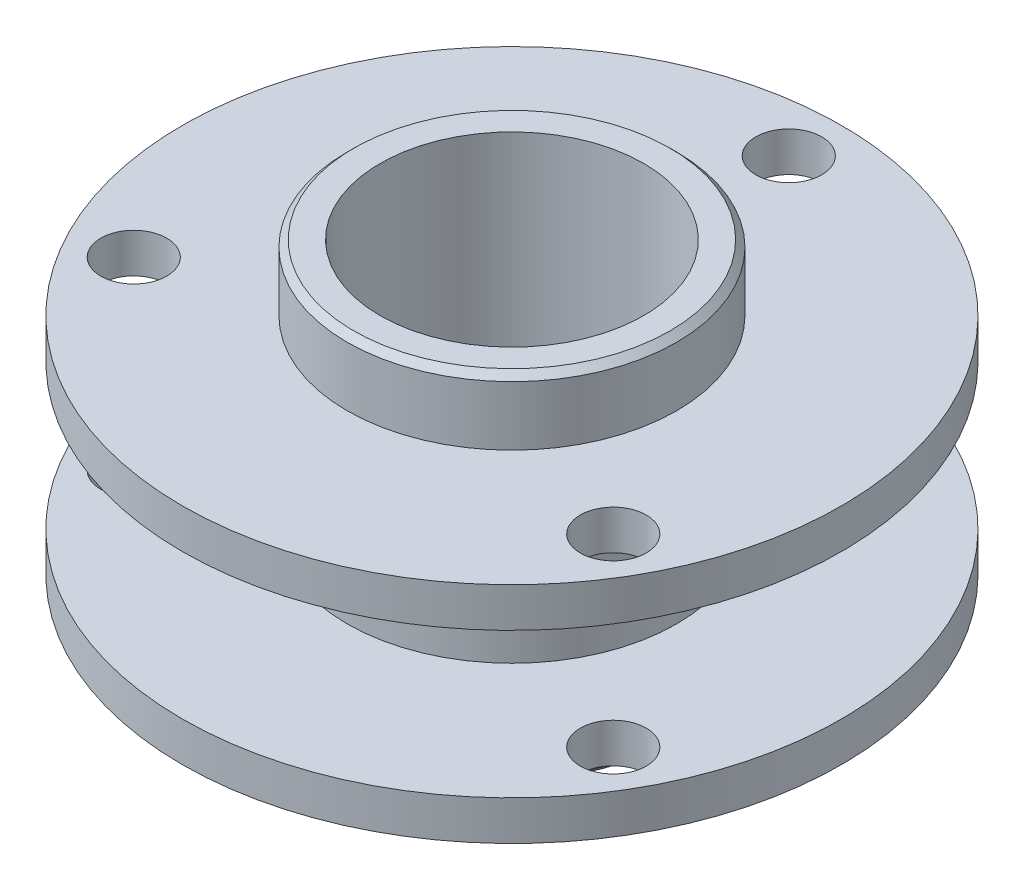
ISO-10303-21;
HEADER;
FILE_DESCRIPTION(('STEP AP214'),'2;1');
FILE_NAME('part.step','',(''),(''),'','','');
FILE_SCHEMA(('AUTOMOTIVE_DESIGN { 1 0 10303 214 1 1 1 1 }'));
ENDSEC;
DATA;
#1=APPLICATION_CONTEXT('core data for automotive mechanical design processes');
#2=APPLICATION_PROTOCOL_DEFINITION('international standard','automotive_design',2000,#1);
#3=PRODUCT_CONTEXT('',#1,'mechanical');
#4=PRODUCT('Part','Part','',(#3));
#5=PRODUCT_RELATED_PRODUCT_CATEGORY('part','',(#4));
#6=PRODUCT_DEFINITION_FORMATION('','',#4);
#7=PRODUCT_DEFINITION_CONTEXT('part definition',#1,'design');
#8=PRODUCT_DEFINITION('design','',#6,#7);
#9=PRODUCT_DEFINITION_SHAPE('','',#8);
#10=(LENGTH_UNIT() NAMED_UNIT(*) SI_UNIT(.MILLI.,.METRE.));
#11=(NAMED_UNIT(*) PLANE_ANGLE_UNIT() SI_UNIT($,.RADIAN.));
#12=(NAMED_UNIT(*) SI_UNIT($,.STERADIAN.) SOLID_ANGLE_UNIT());
#13=UNCERTAINTY_MEASURE_WITH_UNIT(LENGTH_MEASURE(1.E-05),#10,'distance_accuracy_value','');
#14=(GEOMETRIC_REPRESENTATION_CONTEXT(3) GLOBAL_UNCERTAINTY_ASSIGNED_CONTEXT((#13)) GLOBAL_UNIT_ASSIGNED_CONTEXT((#10,
#11,#12)) REPRESENTATION_CONTEXT('',''));
#15=CARTESIAN_POINT('',(0.,0.,0.));
#16=DIRECTION('',(0.,0.,1.));
#17=DIRECTION('',(1.,0.,0.));
#18=AXIS2_PLACEMENT_3D('',#15,#16,#17);
#19=CARTESIAN_POINT('',(0.,-13.5,0.));
#20=DIRECTION('',(0.,-1.,0.));
#21=DIRECTION('',(0.,0.,-1.));
#22=AXIS2_PLACEMENT_3D('',#19,#20,#21);
#23=PLANE('',#22);
#24=CARTESIAN_POINT('',(0.,-13.5,0.));
#25=DIRECTION('',(0.,1.,0.));
#26=DIRECTION('',(0.,0.,1.));
#27=AXIS2_PLACEMENT_3D('',#24,#25,#26);
#28=CIRCLE('',#27,10.);
#29=CARTESIAN_POINT('',(0.,-13.5,10.));
#30=VERTEX_POINT('',#29);
#31=EDGE_CURVE('E18',#30,#30,#28,.T.);
#32=ORIENTED_EDGE('',*,*,#31,.T.);
#33=EDGE_LOOP('',(#32));
#34=FACE_BOUND('',#33,.T.);
#35=CARTESIAN_POINT('',(0.,-13.5,0.));
#36=DIRECTION('',(0.,1.,0.));
#37=DIRECTION('',(0.,0.,1.));
#38=AXIS2_PLACEMENT_3D('',#35,#36,#37);
#39=CIRCLE('',#38,12.);
#40=CARTESIAN_POINT('',(0.,-13.5,12.));
#41=VERTEX_POINT('',#40);
#42=EDGE_CURVE('E92',#41,#41,#39,.T.);
#43=ORIENTED_EDGE('',*,*,#42,.F.);
#44=EDGE_LOOP('',(#43));
#45=FACE_BOUND('',#44,.T.);
#46=ADVANCED_FACE('F15',(#34,#45),#23,.T.);
#47=CARTESIAN_POINT('',(0.,-13.5,0.));
#48=DIRECTION('',(0.,1.,0.));
#49=DIRECTION('',(0.,0.,1.));
#50=AXIS2_PLACEMENT_3D('',#47,#48,#49);
#51=CYLINDRICAL_SURFACE('',#50,10.);
#52=ORIENTED_EDGE('',*,*,#31,.F.);
#53=EDGE_LOOP('',(#52));
#54=FACE_BOUND('',#53,.T.);
#55=CARTESIAN_POINT('',(0.,13.5,0.));
#56=DIRECTION('',(0.,1.,0.));
#57=DIRECTION('',(0.,0.,1.));
#58=AXIS2_PLACEMENT_3D('',#55,#56,#57);
#59=CIRCLE('',#58,10.);
#60=CARTESIAN_POINT('',(0.,13.5,10.));
#61=VERTEX_POINT('',#60);
#62=EDGE_CURVE('E90',#61,#61,#59,.T.);
#63=ORIENTED_EDGE('',*,*,#62,.T.);
#64=EDGE_LOOP('',(#63));
#65=FACE_BOUND('',#64,.T.);
#66=ADVANCED_FACE('F101',(#54,#65),#51,.F.);
#67=CARTESIAN_POINT('',(0.,-13.,0.));
#68=DIRECTION('',(0.,1.,0.));
#69=DIRECTION('',(0.,0.,1.));
#70=AXIS2_PLACEMENT_3D('',#67,#68,#69);
#71=CONICAL_SURFACE('',#70,12.5,0.785398163397442);
#72=ORIENTED_EDGE('',*,*,#42,.T.);
#73=EDGE_LOOP('',(#72));
#74=FACE_BOUND('',#73,.T.);
#75=CARTESIAN_POINT('',(0.,-13.,0.));
#76=DIRECTION('',(0.,1.,0.));
#77=DIRECTION('',(0.,0.,1.));
#78=AXIS2_PLACEMENT_3D('',#75,#76,#77);
#79=CIRCLE('',#78,12.5);
#80=CARTESIAN_POINT('',(0.,-13.,12.5));
#81=VERTEX_POINT('',#80);
#82=EDGE_CURVE('E30',#81,#81,#79,.T.);
#83=ORIENTED_EDGE('',*,*,#82,.F.);
#84=EDGE_LOOP('',(#83));
#85=FACE_BOUND('',#84,.T.);
#86=ADVANCED_FACE('F104',(#74,#85),#71,.T.);
#87=CARTESIAN_POINT('',(0.,13.5,0.));
#88=DIRECTION('',(0.,-1.,0.));
#89=DIRECTION('',(0.,0.,-1.));
#90=AXIS2_PLACEMENT_3D('',#87,#88,#89);
#91=PLANE('',#90);
#92=ORIENTED_EDGE('',*,*,#62,.F.);
#93=EDGE_LOOP('',(#92));
#94=FACE_BOUND('',#93,.T.);
#95=CARTESIAN_POINT('',(0.,13.5,0.));
#96=DIRECTION('',(0.,-1.,0.));
#97=DIRECTION('',(1.,0.,0.));
#98=AXIS2_PLACEMENT_3D('',#95,#96,#97);
#99=CIRCLE('',#98,12.);
#100=CARTESIAN_POINT('',(12.,13.5,0.));
#101=VERTEX_POINT('',#100);
#102=EDGE_CURVE('E87',#101,#101,#99,.T.);
#103=ORIENTED_EDGE('',*,*,#102,.F.);
#104=EDGE_LOOP('',(#103));
#105=FACE_BOUND('',#104,.T.);
#106=ADVANCED_FACE('F107',(#94,#105),#91,.F.);
#107=CARTESIAN_POINT('',(0.,13.5,0.));
#108=DIRECTION('',(0.,1.,0.));
#109=DIRECTION('',(0.,0.,1.));
#110=AXIS2_PLACEMENT_3D('',#107,#108,#109);
#111=CYLINDRICAL_SURFACE('',#110,12.5);
#112=ORIENTED_EDGE('',*,*,#82,.T.);
#113=EDGE_LOOP('',(#112));
#114=FACE_BOUND('',#113,.T.);
#115=CARTESIAN_POINT('',(0.,-8.49999999999999,0.));
#116=DIRECTION('',(0.,1.,0.));
#117=DIRECTION('',(0.,0.,1.));
#118=AXIS2_PLACEMENT_3D('',#115,#116,#117);
#119=CIRCLE('',#118,12.5);
#120=CARTESIAN_POINT('',(0.,-8.49999999999999,12.5));
#121=VERTEX_POINT('',#120);
#122=EDGE_CURVE('E84',#121,#121,#119,.T.);
#123=ORIENTED_EDGE('',*,*,#122,.F.);
#124=EDGE_LOOP('',(#123));
#125=FACE_BOUND('',#124,.T.);
#126=ADVANCED_FACE('F110',(#114,#125),#111,.T.);
#127=CARTESIAN_POINT('',(0.,13.,0.));
#128=DIRECTION('',(0.,-1.,0.));
#129=DIRECTION('',(1.,0.,0.));
#130=AXIS2_PLACEMENT_3D('',#127,#128,#129);
#131=CONICAL_SURFACE('',#130,12.5,0.785398163397453);
#132=CARTESIAN_POINT('',(0.,13.,0.));
#133=DIRECTION('',(0.,1.,0.));
#134=DIRECTION('',(0.,0.,1.));
#135=AXIS2_PLACEMENT_3D('',#132,#133,#134);
#136=CIRCLE('',#135,12.5);
#137=CARTESIAN_POINT('',(0.,13.,12.5));
#138=VERTEX_POINT('',#137);
#139=EDGE_CURVE('E83',#138,#138,#136,.F.);
#140=ORIENTED_EDGE('',*,*,#139,.F.);
#141=EDGE_LOOP('',(#140));
#142=FACE_BOUND('',#141,.T.);
#143=ORIENTED_EDGE('',*,*,#102,.T.);
#144=EDGE_LOOP('',(#143));
#145=FACE_BOUND('',#144,.T.);
#146=ADVANCED_FACE('F114',(#142,#145),#131,.T.);
#147=CARTESIAN_POINT('',(0.,-8.5,0.));
#148=DIRECTION('',(0.,-1.,0.));
#149=DIRECTION('',(0.,0.,-1.));
#150=AXIS2_PLACEMENT_3D('',#147,#148,#149);
#151=PLANE('',#150);
#152=CARTESIAN_POINT('',(0.,-8.5,0.));
#153=DIRECTION('',(0.,1.,0.));
#154=DIRECTION('',(0.,0.,1.));
#155=AXIS2_PLACEMENT_3D('',#152,#153,#154);
#156=CIRCLE('',#155,25.);
#157=CARTESIAN_POINT('',(0.,-8.5,25.));
#158=VERTEX_POINT('',#157);
#159=EDGE_CURVE('E71',#158,#158,#156,.T.);
#160=ORIENTED_EDGE('',*,*,#159,.F.);
#161=EDGE_LOOP('',(#160));
#162=FACE_BOUND('',#161,.T.);
#163=ORIENTED_EDGE('',*,*,#122,.T.);
#164=EDGE_LOOP('',(#163));
#165=FACE_BOUND('',#164,.T.);
#166=CARTESIAN_POINT('',(-18.1865334794732,-8.5,10.5));
#167=DIRECTION('',(0.,1.,0.));
#168=DIRECTION('',(0.,0.,1.));
#169=AXIS2_PLACEMENT_3D('',#166,#167,#168);
#170=CIRCLE('',#169,2.5);
#171=CARTESIAN_POINT('',(-18.1865334794732,-8.5,13.));
#172=VERTEX_POINT('',#171);
#173=EDGE_CURVE('E74',#172,#172,#170,.T.);
#174=ORIENTED_EDGE('',*,*,#173,.T.);
#175=EDGE_LOOP('',(#174));
#176=FACE_BOUND('',#175,.T.);
#177=CARTESIAN_POINT('',(18.1865334794732,-8.5,10.5));
#178=DIRECTION('',(0.,1.,0.));
#179=DIRECTION('',(0.,0.,1.));
#180=AXIS2_PLACEMENT_3D('',#177,#178,#179);
#181=CIRCLE('',#180,2.5);
#182=CARTESIAN_POINT('',(18.1865334794732,-8.5,13.));
#183=VERTEX_POINT('',#182);
#184=EDGE_CURVE('E77',#183,#183,#181,.T.);
#185=ORIENTED_EDGE('',*,*,#184,.T.);
#186=EDGE_LOOP('',(#185));
#187=FACE_BOUND('',#186,.T.);
#188=CARTESIAN_POINT('',(0.,-8.5,-21.));
#189=DIRECTION('',(0.,1.,0.));
#190=DIRECTION('',(0.,0.,1.));
#191=AXIS2_PLACEMENT_3D('',#188,#189,#190);
#192=CIRCLE('',#191,2.5);
#193=CARTESIAN_POINT('',(0.,-8.5,-18.5));
#194=VERTEX_POINT('',#193);
#195=EDGE_CURVE('E80',#194,#194,#192,.T.);
#196=ORIENTED_EDGE('',*,*,#195,.T.);
#197=EDGE_LOOP('',(#196));
#198=FACE_BOUND('',#197,.T.);
#199=ADVANCED_FACE('F116',(#162,#165,#176,#187,#198),#151,.T.);
#200=CARTESIAN_POINT('',(0.,13.5,0.));
#201=DIRECTION('',(0.,1.,0.));
#202=DIRECTION('',(0.,0.,1.));
#203=AXIS2_PLACEMENT_3D('',#200,#201,#202);
#204=CYLINDRICAL_SURFACE('',#203,12.5);
#205=ORIENTED_EDGE('',*,*,#139,.T.);
#206=EDGE_LOOP('',(#205));
#207=FACE_BOUND('',#206,.T.);
#208=CARTESIAN_POINT('',(0.,8.49999999999999,0.));
#209=DIRECTION('',(0.,1.,0.));
#210=DIRECTION('',(0.,0.,1.));
#211=AXIS2_PLACEMENT_3D('',#208,#209,#210);
#212=CIRCLE('',#211,12.5);
#213=CARTESIAN_POINT('',(0.,8.49999999999999,12.5));
#214=VERTEX_POINT('',#213);
#215=EDGE_CURVE('E68',#214,#214,#212,.T.);
#216=ORIENTED_EDGE('',*,*,#215,.T.);
#217=EDGE_LOOP('',(#216));
#218=FACE_BOUND('',#217,.T.);
#219=ADVANCED_FACE('F124',(#207,#218),#204,.T.);
#220=CARTESIAN_POINT('',(0.,-13.5,-21.));
#221=DIRECTION('',(0.,1.,0.));
#222=DIRECTION('',(0.,0.,1.));
#223=AXIS2_PLACEMENT_3D('',#220,#221,#222);
#224=CYLINDRICAL_SURFACE('',#223,2.5);
#225=CARTESIAN_POINT('',(0.,-5.5,-21.));
#226=DIRECTION('',(0.,1.,0.));
#227=DIRECTION('',(0.,0.,1.));
#228=AXIS2_PLACEMENT_3D('',#225,#226,#227);
#229=CIRCLE('',#228,2.5);
#230=CARTESIAN_POINT('',(0.,-5.5,-18.5));
#231=VERTEX_POINT('',#230);
#232=EDGE_CURVE('E65',#231,#231,#229,.F.);
#233=ORIENTED_EDGE('',*,*,#232,.F.);
#234=EDGE_LOOP('',(#233));
#235=FACE_BOUND('',#234,.T.);
#236=ORIENTED_EDGE('',*,*,#195,.F.);
#237=EDGE_LOOP('',(#236));
#238=FACE_BOUND('',#237,.T.);
#239=ADVANCED_FACE('F176',(#235,#238),#224,.F.);
#240=CARTESIAN_POINT('',(18.1865334794732,-13.5,10.5));
#241=DIRECTION('',(0.,1.,0.));
#242=DIRECTION('',(0.,0.,1.));
#243=AXIS2_PLACEMENT_3D('',#240,#241,#242);
#244=CYLINDRICAL_SURFACE('',#243,2.5);
#245=CARTESIAN_POINT('',(18.1865334794732,-5.5,10.5));
#246=DIRECTION('',(0.,1.,0.));
#247=DIRECTION('',(0.,0.,1.));
#248=AXIS2_PLACEMENT_3D('',#245,#246,#247);
#249=CIRCLE('',#248,2.5);
#250=CARTESIAN_POINT('',(18.1865334794732,-5.5,13.));
#251=VERTEX_POINT('',#250);
#252=EDGE_CURVE('E62',#251,#251,#249,.F.);
#253=ORIENTED_EDGE('',*,*,#252,.F.);
#254=EDGE_LOOP('',(#253));
#255=FACE_BOUND('',#254,.T.);
#256=ORIENTED_EDGE('',*,*,#184,.F.);
#257=EDGE_LOOP('',(#256));
#258=FACE_BOUND('',#257,.T.);
#259=ADVANCED_FACE('F172',(#255,#258),#244,.F.);
#260=CARTESIAN_POINT('',(-18.1865334794732,-13.5,10.5));
#261=DIRECTION('',(0.,1.,0.));
#262=DIRECTION('',(0.,0.,1.));
#263=AXIS2_PLACEMENT_3D('',#260,#261,#262);
#264=CYLINDRICAL_SURFACE('',#263,2.5);
#265=CARTESIAN_POINT('',(-18.1865334794732,-5.5,10.5));
#266=DIRECTION('',(0.,1.,0.));
#267=DIRECTION('',(0.,0.,1.));
#268=AXIS2_PLACEMENT_3D('',#265,#266,#267);
#269=CIRCLE('',#268,2.5);
#270=CARTESIAN_POINT('',(-18.1865334794732,-5.5,13.));
#271=VERTEX_POINT('',#270);
#272=EDGE_CURVE('E59',#271,#271,#269,.F.);
#273=ORIENTED_EDGE('',*,*,#272,.F.);
#274=EDGE_LOOP('',(#273));
#275=FACE_BOUND('',#274,.T.);
#276=ORIENTED_EDGE('',*,*,#173,.F.);
#277=EDGE_LOOP('',(#276));
#278=FACE_BOUND('',#277,.T.);
#279=ADVANCED_FACE('F168',(#275,#278),#264,.F.);
#280=CARTESIAN_POINT('',(0.,13.5,0.));
#281=DIRECTION('',(0.,1.,0.));
#282=DIRECTION('',(0.,0.,1.));
#283=AXIS2_PLACEMENT_3D('',#280,#281,#282);
#284=CYLINDRICAL_SURFACE('',#283,25.);
#285=ORIENTED_EDGE('',*,*,#159,.T.);
#286=EDGE_LOOP('',(#285));
#287=FACE_BOUND('',#286,.T.);
#288=CARTESIAN_POINT('',(0.,-5.5,0.));
#289=DIRECTION('',(0.,1.,0.));
#290=DIRECTION('',(0.,0.,1.));
#291=AXIS2_PLACEMENT_3D('',#288,#289,#290);
#292=CIRCLE('',#291,25.);
#293=CARTESIAN_POINT('',(0.,-5.5,25.));
#294=VERTEX_POINT('',#293);
#295=EDGE_CURVE('E56',#294,#294,#292,.T.);
#296=ORIENTED_EDGE('',*,*,#295,.F.);
#297=EDGE_LOOP('',(#296));
#298=FACE_BOUND('',#297,.T.);
#299=ADVANCED_FACE('F164',(#287,#298),#284,.T.);
#300=CARTESIAN_POINT('',(0.,8.5,0.));
#301=DIRECTION('',(0.,-1.,0.));
#302=DIRECTION('',(0.,0.,-1.));
#303=AXIS2_PLACEMENT_3D('',#300,#301,#302);
#304=PLANE('',#303);
#305=CARTESIAN_POINT('',(0.,8.5,0.));
#306=DIRECTION('',(0.,1.,0.));
#307=DIRECTION('',(0.,0.,1.));
#308=AXIS2_PLACEMENT_3D('',#305,#306,#307);
#309=CIRCLE('',#308,25.);
#310=CARTESIAN_POINT('',(0.,8.5,25.));
#311=VERTEX_POINT('',#310);
#312=EDGE_CURVE('E44',#311,#311,#309,.F.);
#313=ORIENTED_EDGE('',*,*,#312,.F.);
#314=EDGE_LOOP('',(#313));
#315=FACE_BOUND('',#314,.T.);
#316=ORIENTED_EDGE('',*,*,#215,.F.);
#317=EDGE_LOOP('',(#316));
#318=FACE_BOUND('',#317,.T.);
#319=CARTESIAN_POINT('',(-18.1865334794732,8.5,10.5));
#320=DIRECTION('',(0.,1.,0.));
#321=DIRECTION('',(0.,0.,1.));
#322=AXIS2_PLACEMENT_3D('',#319,#320,#321);
#323=CIRCLE('',#322,2.5);
#324=CARTESIAN_POINT('',(-18.1865334794732,8.5,13.));
#325=VERTEX_POINT('',#324);
#326=EDGE_CURVE('E47',#325,#325,#323,.F.);
#327=ORIENTED_EDGE('',*,*,#326,.T.);
#328=EDGE_LOOP('',(#327));
#329=FACE_BOUND('',#328,.T.);
#330=CARTESIAN_POINT('',(18.1865334794732,8.5,10.5));
#331=DIRECTION('',(0.,1.,0.));
#332=DIRECTION('',(0.,0.,1.));
#333=AXIS2_PLACEMENT_3D('',#330,#331,#332);
#334=CIRCLE('',#333,2.5);
#335=CARTESIAN_POINT('',(18.1865334794732,8.5,13.));
#336=VERTEX_POINT('',#335);
#337=EDGE_CURVE('E50',#336,#336,#334,.F.);
#338=ORIENTED_EDGE('',*,*,#337,.T.);
#339=EDGE_LOOP('',(#338));
#340=FACE_BOUND('',#339,.T.);
#341=CARTESIAN_POINT('',(0.,8.5,-21.));
#342=DIRECTION('',(0.,1.,0.));
#343=DIRECTION('',(0.,0.,1.));
#344=AXIS2_PLACEMENT_3D('',#341,#342,#343);
#345=CIRCLE('',#344,2.5);
#346=CARTESIAN_POINT('',(0.,8.5,-18.5));
#347=VERTEX_POINT('',#346);
#348=EDGE_CURVE('E53',#347,#347,#345,.F.);
#349=ORIENTED_EDGE('',*,*,#348,.T.);
#350=EDGE_LOOP('',(#349));
#351=FACE_BOUND('',#350,.T.);
#352=ADVANCED_FACE('F160',(#315,#318,#329,#340,#351),#304,.F.);
#353=CARTESIAN_POINT('',(0.,-5.5,0.));
#354=DIRECTION('',(0.,1.,0.));
#355=DIRECTION('',(0.,0.,1.));
#356=AXIS2_PLACEMENT_3D('',#353,#354,#355);
#357=PLANE('',#356);
#358=CARTESIAN_POINT('',(0.,-5.5,0.));
#359=DIRECTION('',(0.,1.,0.));
#360=DIRECTION('',(0.,0.,1.));
#361=AXIS2_PLACEMENT_3D('',#358,#359,#360);
#362=CIRCLE('',#361,12.5);
#363=CARTESIAN_POINT('',(0.,-5.5,12.5));
#364=VERTEX_POINT('',#363);
#365=EDGE_CURVE('E41',#364,#364,#362,.T.);
#366=ORIENTED_EDGE('',*,*,#365,.F.);
#367=EDGE_LOOP('',(#366));
#368=FACE_BOUND('',#367,.T.);
#369=ORIENTED_EDGE('',*,*,#295,.T.);
#370=EDGE_LOOP('',(#369));
#371=FACE_BOUND('',#370,.T.);
#372=ORIENTED_EDGE('',*,*,#272,.T.);
#373=EDGE_LOOP('',(#372));
#374=FACE_BOUND('',#373,.T.);
#375=ORIENTED_EDGE('',*,*,#252,.T.);
#376=EDGE_LOOP('',(#375));
#377=FACE_BOUND('',#376,.T.);
#378=ORIENTED_EDGE('',*,*,#232,.T.);
#379=EDGE_LOOP('',(#378));
#380=FACE_BOUND('',#379,.T.);
#381=ADVANCED_FACE('F156',(#368,#371,#374,#377,#380),#357,.T.);
#382=CARTESIAN_POINT('',(0.,-13.5,-21.));
#383=DIRECTION('',(0.,1.,0.));
#384=DIRECTION('',(0.,0.,1.));
#385=AXIS2_PLACEMENT_3D('',#382,#383,#384);
#386=CYLINDRICAL_SURFACE('',#385,2.5);
#387=CARTESIAN_POINT('',(0.,5.5,-21.));
#388=DIRECTION('',(0.,1.,0.));
#389=DIRECTION('',(0.,0.,1.));
#390=AXIS2_PLACEMENT_3D('',#387,#388,#389);
#391=CIRCLE('',#390,2.5);
#392=CARTESIAN_POINT('',(0.,5.5,-18.5));
#393=VERTEX_POINT('',#392);
#394=EDGE_CURVE('E38',#393,#393,#391,.F.);
#395=ORIENTED_EDGE('',*,*,#394,.T.);
#396=EDGE_LOOP('',(#395));
#397=FACE_BOUND('',#396,.T.);
#398=ORIENTED_EDGE('',*,*,#348,.F.);
#399=EDGE_LOOP('',(#398));
#400=FACE_BOUND('',#399,.T.);
#401=ADVANCED_FACE('F152',(#397,#400),#386,.F.);
#402=CARTESIAN_POINT('',(18.1865334794732,-13.5,10.5));
#403=DIRECTION('',(0.,1.,0.));
#404=DIRECTION('',(0.,0.,1.));
#405=AXIS2_PLACEMENT_3D('',#402,#403,#404);
#406=CYLINDRICAL_SURFACE('',#405,2.5);
#407=CARTESIAN_POINT('',(18.1865334794732,5.5,10.5));
#408=DIRECTION('',(0.,1.,0.));
#409=DIRECTION('',(0.,0.,1.));
#410=AXIS2_PLACEMENT_3D('',#407,#408,#409);
#411=CIRCLE('',#410,2.5);
#412=CARTESIAN_POINT('',(18.1865334794732,5.5,13.));
#413=VERTEX_POINT('',#412);
#414=EDGE_CURVE('E35',#413,#413,#411,.F.);
#415=ORIENTED_EDGE('',*,*,#414,.T.);
#416=EDGE_LOOP('',(#415));
#417=FACE_BOUND('',#416,.T.);
#418=ORIENTED_EDGE('',*,*,#337,.F.);
#419=EDGE_LOOP('',(#418));
#420=FACE_BOUND('',#419,.T.);
#421=ADVANCED_FACE('F148',(#417,#420),#406,.F.);
#422=CARTESIAN_POINT('',(-18.1865334794732,-13.5,10.5));
#423=DIRECTION('',(0.,1.,0.));
#424=DIRECTION('',(0.,0.,1.));
#425=AXIS2_PLACEMENT_3D('',#422,#423,#424);
#426=CYLINDRICAL_SURFACE('',#425,2.5);
#427=CARTESIAN_POINT('',(-18.1865334794732,5.5,10.5));
#428=DIRECTION('',(0.,1.,0.));
#429=DIRECTION('',(0.,0.,1.));
#430=AXIS2_PLACEMENT_3D('',#427,#428,#429);
#431=CIRCLE('',#430,2.5);
#432=CARTESIAN_POINT('',(-18.1865334794732,5.5,13.));
#433=VERTEX_POINT('',#432);
#434=EDGE_CURVE('E27',#433,#433,#431,.F.);
#435=ORIENTED_EDGE('',*,*,#434,.T.);
#436=EDGE_LOOP('',(#435));
#437=FACE_BOUND('',#436,.T.);
#438=ORIENTED_EDGE('',*,*,#326,.F.);
#439=EDGE_LOOP('',(#438));
#440=FACE_BOUND('',#439,.T.);
#441=ADVANCED_FACE('F144',(#437,#440),#426,.F.);
#442=CARTESIAN_POINT('',(0.,13.5,0.));
#443=DIRECTION('',(0.,1.,0.));
#444=DIRECTION('',(0.,0.,1.));
#445=AXIS2_PLACEMENT_3D('',#442,#443,#444);
#446=CYLINDRICAL_SURFACE('',#445,25.);
#447=ORIENTED_EDGE('',*,*,#312,.T.);
#448=EDGE_LOOP('',(#447));
#449=FACE_BOUND('',#448,.T.);
#450=CARTESIAN_POINT('',(0.,5.5,0.));
#451=DIRECTION('',(0.,1.,0.));
#452=DIRECTION('',(0.,0.,1.));
#453=AXIS2_PLACEMENT_3D('',#450,#451,#452);
#454=CIRCLE('',#453,25.);
#455=CARTESIAN_POINT('',(0.,5.5,25.));
#456=VERTEX_POINT('',#455);
#457=EDGE_CURVE('E22',#456,#456,#454,.T.);
#458=ORIENTED_EDGE('',*,*,#457,.T.);
#459=EDGE_LOOP('',(#458));
#460=FACE_BOUND('',#459,.T.);
#461=ADVANCED_FACE('F138',(#449,#460),#446,.T.);
#462=CARTESIAN_POINT('',(0.,13.5,0.));
#463=DIRECTION('',(0.,1.,0.));
#464=DIRECTION('',(0.,0.,1.));
#465=AXIS2_PLACEMENT_3D('',#462,#463,#464);
#466=CYLINDRICAL_SURFACE('',#465,12.5);
#467=CARTESIAN_POINT('',(0.,5.5,0.));
#468=DIRECTION('',(0.,1.,0.));
#469=DIRECTION('',(0.,0.,1.));
#470=AXIS2_PLACEMENT_3D('',#467,#468,#469);
#471=CIRCLE('',#470,12.5);
#472=CARTESIAN_POINT('',(0.,5.5,12.5));
#473=VERTEX_POINT('',#472);
#474=EDGE_CURVE('E10',#473,#473,#471,.F.);
#475=ORIENTED_EDGE('',*,*,#474,.T.);
#476=EDGE_LOOP('',(#475));
#477=FACE_BOUND('',#476,.T.);
#478=ORIENTED_EDGE('',*,*,#365,.T.);
#479=EDGE_LOOP('',(#478));
#480=FACE_BOUND('',#479,.T.);
#481=ADVANCED_FACE('F132',(#477,#480),#466,.T.);
#482=CARTESIAN_POINT('',(0.,5.5,0.));
#483=DIRECTION('',(0.,1.,0.));
#484=DIRECTION('',(0.,0.,1.));
#485=AXIS2_PLACEMENT_3D('',#482,#483,#484);
#486=PLANE('',#485);
#487=ORIENTED_EDGE('',*,*,#474,.F.);
#488=EDGE_LOOP('',(#487));
#489=FACE_BOUND('',#488,.T.);
#490=ORIENTED_EDGE('',*,*,#457,.F.);
#491=EDGE_LOOP('',(#490));
#492=FACE_BOUND('',#491,.T.);
#493=ORIENTED_EDGE('',*,*,#434,.F.);
#494=EDGE_LOOP('',(#493));
#495=FACE_BOUND('',#494,.T.);
#496=ORIENTED_EDGE('',*,*,#414,.F.);
#497=EDGE_LOOP('',(#496));
#498=FACE_BOUND('',#497,.T.);
#499=ORIENTED_EDGE('',*,*,#394,.F.);
#500=EDGE_LOOP('',(#499));
#501=FACE_BOUND('',#500,.T.);
#502=ADVANCED_FACE('F130',(#489,#492,#495,#498,#501),#486,.F.);
#503=CLOSED_SHELL('',(#46,#66,#86,#106,#126,#146,#199,#219,#239,#259,#279,#299,#352,#381,#401,
#421,#441,#461,#481,#502));
#504=MANIFOLD_SOLID_BREP('B1',#503);
#505=ADVANCED_BREP_SHAPE_REPRESENTATION('',(#18,#504),#14);
#506=SHAPE_DEFINITION_REPRESENTATION(#9,#505);
ENDSEC;
END-ISO-10303-21;
